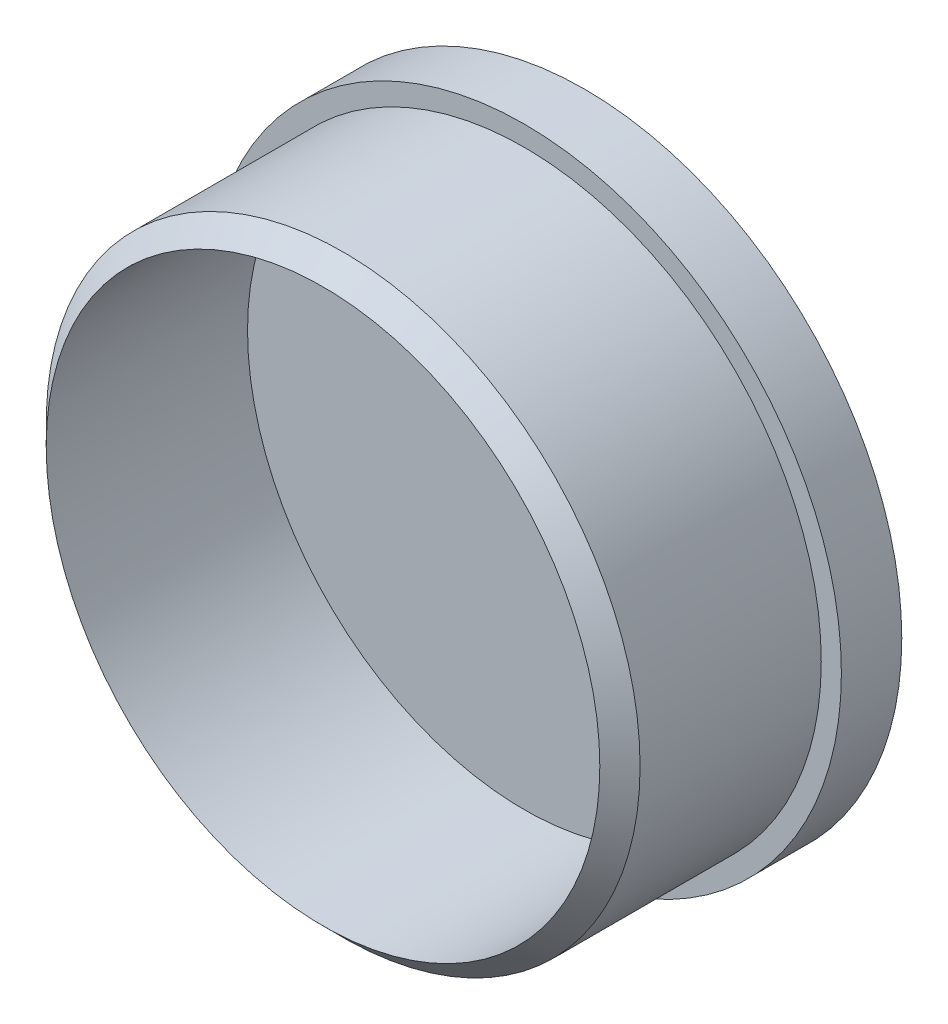
ISO-10303-21;
HEADER;
FILE_DESCRIPTION(('STEP AP214'),'2;1');
FILE_NAME('part.step','',(''),(''),'','','');
FILE_SCHEMA(('AUTOMOTIVE_DESIGN { 1 0 10303 214 1 1 1 1 }'));
ENDSEC;
DATA;
#1=APPLICATION_CONTEXT('core data for automotive mechanical design processes');
#2=APPLICATION_PROTOCOL_DEFINITION('international standard','automotive_design',2000,#1);
#3=PRODUCT_CONTEXT('',#1,'mechanical');
#4=PRODUCT('Part','Part','',(#3));
#5=PRODUCT_RELATED_PRODUCT_CATEGORY('part','',(#4));
#6=PRODUCT_DEFINITION_FORMATION('','',#4);
#7=PRODUCT_DEFINITION_CONTEXT('part definition',#1,'design');
#8=PRODUCT_DEFINITION('design','',#6,#7);
#9=PRODUCT_DEFINITION_SHAPE('','',#8);
#10=(LENGTH_UNIT() NAMED_UNIT(*) SI_UNIT(.MILLI.,.METRE.));
#11=(NAMED_UNIT(*) PLANE_ANGLE_UNIT() SI_UNIT($,.RADIAN.));
#12=(NAMED_UNIT(*) SI_UNIT($,.STERADIAN.) SOLID_ANGLE_UNIT());
#13=UNCERTAINTY_MEASURE_WITH_UNIT(LENGTH_MEASURE(1.E-05),#10,'distance_accuracy_value','');
#14=(GEOMETRIC_REPRESENTATION_CONTEXT(3) GLOBAL_UNCERTAINTY_ASSIGNED_CONTEXT((#13)) GLOBAL_UNIT_ASSIGNED_CONTEXT((#10,
#11,#12)) REPRESENTATION_CONTEXT('',''));
#15=CARTESIAN_POINT('',(0.,0.,0.));
#16=DIRECTION('',(0.,0.,1.));
#17=DIRECTION('',(1.,0.,0.));
#18=AXIS2_PLACEMENT_3D('',#15,#16,#17);
#19=CARTESIAN_POINT('',(0.,0.,6.));
#20=DIRECTION('',(0.,0.,-1.));
#21=DIRECTION('',(-1.,0.,0.));
#22=AXIS2_PLACEMENT_3D('',#19,#20,#21);
#23=CYLINDRICAL_SURFACE('',#22,31.5);
#24=CARTESIAN_POINT('',(0.,0.,6.));
#25=DIRECTION('',(0.,0.,1.));
#26=DIRECTION('',(1.,0.,0.));
#27=AXIS2_PLACEMENT_3D('',#24,#25,#26);
#28=CIRCLE('',#27,31.5);
#29=CARTESIAN_POINT('',(31.5,0.,6.));
#30=VERTEX_POINT('',#29);
#31=EDGE_CURVE('E53',#30,#30,#28,.T.);
#32=ORIENTED_EDGE('',*,*,#31,.F.);
#33=EDGE_LOOP('',(#32));
#34=FACE_BOUND('',#33,.T.);
#35=CARTESIAN_POINT('',(0.,0.,0.));
#36=DIRECTION('',(0.,0.,1.));
#37=DIRECTION('',(1.,0.,0.));
#38=AXIS2_PLACEMENT_3D('',#35,#36,#37);
#39=CIRCLE('',#38,31.5);
#40=CARTESIAN_POINT('',(31.5,0.,0.));
#41=VERTEX_POINT('',#40);
#42=EDGE_CURVE('E58',#41,#41,#39,.T.);
#43=ORIENTED_EDGE('',*,*,#42,.T.);
#44=EDGE_LOOP('',(#43));
#45=FACE_BOUND('',#44,.T.);
#46=ADVANCED_FACE('F39',(#34,#45),#23,.T.);
#47=CARTESIAN_POINT('',(0.,0.,6.));
#48=DIRECTION('',(0.,0.,1.));
#49=DIRECTION('',(1.,0.,0.));
#50=AXIS2_PLACEMENT_3D('',#47,#48,#49);
#51=PLANE('',#50);
#52=CARTESIAN_POINT('',(0.,0.,6.));
#53=DIRECTION('',(0.,0.,1.));
#54=DIRECTION('',(1.,0.,0.));
#55=AXIS2_PLACEMENT_3D('',#52,#53,#54);
#56=CIRCLE('',#55,29.5);
#57=CARTESIAN_POINT('',(29.5,0.,6.));
#58=VERTEX_POINT('',#57);
#59=EDGE_CURVE('E63',#58,#58,#56,.T.);
#60=ORIENTED_EDGE('',*,*,#59,.F.);
#61=EDGE_LOOP('',(#60));
#62=FACE_BOUND('',#61,.T.);
#63=ORIENTED_EDGE('',*,*,#31,.T.);
#64=EDGE_LOOP('',(#63));
#65=FACE_BOUND('',#64,.T.);
#66=ADVANCED_FACE('F83',(#62,#65),#51,.T.);
#67=CARTESIAN_POINT('',(0.,0.,0.));
#68=DIRECTION('',(0.,0.,1.));
#69=DIRECTION('',(1.,0.,0.));
#70=AXIS2_PLACEMENT_3D('',#67,#68,#69);
#71=PLANE('',#70);
#72=ORIENTED_EDGE('',*,*,#42,.F.);
#73=EDGE_LOOP('',(#72));
#74=FACE_BOUND('',#73,.T.);
#75=ADVANCED_FACE('F89',(#74),#71,.F.);
#76=CARTESIAN_POINT('',(0.,0.,26.));
#77=DIRECTION('',(0.,0.,-1.));
#78=DIRECTION('',(-1.,0.,0.));
#79=AXIS2_PLACEMENT_3D('',#76,#77,#78);
#80=CYLINDRICAL_SURFACE('',#79,29.5);
#81=CARTESIAN_POINT('',(0.,0.,24.));
#82=DIRECTION('',(0.,0.,1.));
#83=DIRECTION('',(1.,0.,0.));
#84=AXIS2_PLACEMENT_3D('',#81,#82,#83);
#85=CIRCLE('',#84,29.5);
#86=CARTESIAN_POINT('',(29.5,0.,24.));
#87=VERTEX_POINT('',#86);
#88=EDGE_CURVE('E10',#87,#87,#85,.F.);
#89=ORIENTED_EDGE('',*,*,#88,.T.);
#90=EDGE_LOOP('',(#89));
#91=FACE_BOUND('',#90,.T.);
#92=ORIENTED_EDGE('',*,*,#59,.T.);
#93=EDGE_LOOP('',(#92));
#94=FACE_BOUND('',#93,.T.);
#95=ADVANCED_FACE('F95',(#91,#94),#80,.T.);
#96=CARTESIAN_POINT('',(0.,0.,26.));
#97=DIRECTION('',(0.,0.,-1.));
#98=DIRECTION('',(-1.,0.,0.));
#99=AXIS2_PLACEMENT_3D('',#96,#97,#98);
#100=CYLINDRICAL_SURFACE('',#99,27.5);
#101=CARTESIAN_POINT('',(0.,0.,26.));
#102=DIRECTION('',(0.,0.,1.));
#103=DIRECTION('',(1.,0.,0.));
#104=AXIS2_PLACEMENT_3D('',#101,#102,#103);
#105=CIRCLE('',#104,27.5);
#106=CARTESIAN_POINT('',(27.5,0.,26.));
#107=VERTEX_POINT('',#106);
#108=EDGE_CURVE('E68',#107,#107,#105,.T.);
#109=ORIENTED_EDGE('',*,*,#108,.T.);
#110=EDGE_LOOP('',(#109));
#111=FACE_BOUND('',#110,.T.);
#112=CARTESIAN_POINT('',(0.,0.,6.));
#113=DIRECTION('',(0.,0.,1.));
#114=DIRECTION('',(1.,0.,0.));
#115=AXIS2_PLACEMENT_3D('',#112,#113,#114);
#116=CIRCLE('',#115,27.5);
#117=CARTESIAN_POINT('',(27.5,0.,6.));
#118=VERTEX_POINT('',#117);
#119=EDGE_CURVE('E48',#118,#118,#116,.F.);
#120=ORIENTED_EDGE('',*,*,#119,.T.);
#121=EDGE_LOOP('',(#120));
#122=FACE_BOUND('',#121,.T.);
#123=ADVANCED_FACE('F73',(#111,#122),#100,.F.);
#124=ORIENTED_EDGE('',*,*,#119,.F.);
#125=EDGE_LOOP('',(#124));
#126=FACE_BOUND('',#125,.T.);
#127=ADVANCED_FACE('F76',(#126),#51,.T.);
#128=CARTESIAN_POINT('',(0.,0.,26.));
#129=DIRECTION('',(0.,0.,-1.));
#130=DIRECTION('',(-1.,0.,0.));
#131=AXIS2_PLACEMENT_3D('',#128,#129,#130);
#132=CONICAL_SURFACE('',#131,27.5,0.785398163397447);
#133=ORIENTED_EDGE('',*,*,#88,.F.);
#134=EDGE_LOOP('',(#133));
#135=FACE_BOUND('',#134,.T.);
#136=ORIENTED_EDGE('',*,*,#108,.F.);
#137=EDGE_LOOP('',(#136));
#138=FACE_BOUND('',#137,.T.);
#139=ADVANCED_FACE('F42',(#135,#138),#132,.T.);
#140=CLOSED_SHELL('',(#46,#66,#75,#95,#123,#127,#139));
#141=MANIFOLD_SOLID_BREP('B2',#140);
#142=ADVANCED_BREP_SHAPE_REPRESENTATION('',(#18,#141),#14);
#143=SHAPE_DEFINITION_REPRESENTATION(#9,#142);
ENDSEC;
END-ISO-10303-21;
